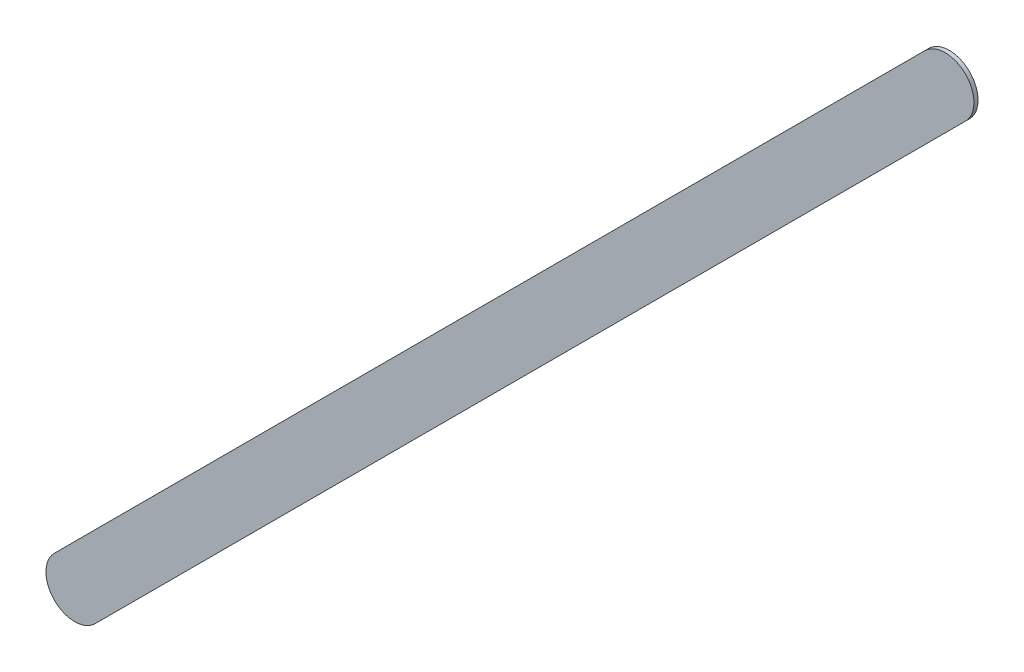
ISO-10303-21;
HEADER;
FILE_DESCRIPTION(('STEP AP214'),'2;1');
FILE_NAME('part.step','',(''),(''),'','','');
FILE_SCHEMA(('AUTOMOTIVE_DESIGN { 1 0 10303 214 1 1 1 1 }'));
ENDSEC;
DATA;
#1=APPLICATION_CONTEXT('core data for automotive mechanical design processes');
#2=APPLICATION_PROTOCOL_DEFINITION('international standard','automotive_design',2000,#1);
#3=PRODUCT_CONTEXT('',#1,'mechanical');
#4=PRODUCT('Part','Part','',(#3));
#5=PRODUCT_RELATED_PRODUCT_CATEGORY('part','',(#4));
#6=PRODUCT_DEFINITION_FORMATION('','',#4);
#7=PRODUCT_DEFINITION_CONTEXT('part definition',#1,'design');
#8=PRODUCT_DEFINITION('design','',#6,#7);
#9=PRODUCT_DEFINITION_SHAPE('','',#8);
#10=(LENGTH_UNIT() NAMED_UNIT(*) SI_UNIT(.MILLI.,.METRE.));
#11=(NAMED_UNIT(*) PLANE_ANGLE_UNIT() SI_UNIT($,.RADIAN.));
#12=(NAMED_UNIT(*) SI_UNIT($,.STERADIAN.) SOLID_ANGLE_UNIT());
#13=UNCERTAINTY_MEASURE_WITH_UNIT(LENGTH_MEASURE(1.E-05),#10,'distance_accuracy_value','');
#14=(GEOMETRIC_REPRESENTATION_CONTEXT(3) GLOBAL_UNCERTAINTY_ASSIGNED_CONTEXT((#13)) GLOBAL_UNIT_ASSIGNED_CONTEXT((#10,
#11,#12)) REPRESENTATION_CONTEXT('',''));
#15=CARTESIAN_POINT('',(0.,0.,0.));
#16=DIRECTION('',(0.,0.,1.));
#17=DIRECTION('',(1.,0.,0.));
#18=AXIS2_PLACEMENT_3D('',#15,#16,#17);
#19=CARTESIAN_POINT('',(89.01617706,73.76262362,0.));
#20=DIRECTION('',(-0.707106781186548,0.707106781186548,0.));
#21=DIRECTION('',(0.707106781186548,0.707106781186548,0.));
#22=AXIS2_PLACEMENT_3D('',#19,#20,#21);
#23=PLANE('',#22);
#24=DIRECTION('',(0.707106781186548,0.707106781186548,0.));
#25=VECTOR('',#24,1.);
#26=CARTESIAN_POINT('',(89.01617706,73.76262362,0.03556));
#27=LINE('',#26,#25);
#28=CARTESIAN_POINT('',(89.01617706,73.76262362,0.03556));
#29=VERTEX_POINT('',#28);
#30=CARTESIAN_POINT('',(96.57677662,81.32322318,0.03556));
#31=VERTEX_POINT('',#30);
#32=EDGE_CURVE('E11',#29,#31,#27,.T.);
#33=ORIENTED_EDGE('',*,*,#32,.F.);
#34=DIRECTION('',(0.,0.,1.));
#35=VECTOR('',#34,1.);
#36=CARTESIAN_POINT('',(89.01617706,73.76262362,0.));
#37=LINE('',#36,#35);
#38=CARTESIAN_POINT('',(89.01617706,73.76262362,0.));
#39=VERTEX_POINT('',#38);
#40=EDGE_CURVE('E24',#39,#29,#37,.T.);
#41=ORIENTED_EDGE('',*,*,#40,.F.);
#42=DIRECTION('',(0.707106781186548,0.707106781186548,0.));
#43=VECTOR('',#42,1.);
#44=CARTESIAN_POINT('',(89.01617706,73.76262362,0.));
#45=LINE('',#44,#43);
#46=CARTESIAN_POINT('',(96.57677662,81.32322318,0.));
#47=VERTEX_POINT('',#46);
#48=EDGE_CURVE('E75',#39,#47,#45,.T.);
#49=ORIENTED_EDGE('',*,*,#48,.T.);
#50=DIRECTION('',(0.,0.,1.));
#51=VECTOR('',#50,1.);
#52=CARTESIAN_POINT('',(96.57677662,81.32322318,0.));
#53=LINE('',#52,#51);
#54=EDGE_CURVE('E37',#47,#31,#53,.T.);
#55=ORIENTED_EDGE('',*,*,#54,.T.);
#56=EDGE_LOOP('',(#33,#41,#49,#55));
#57=FACE_BOUND('',#56,.T.);
#58=ADVANCED_FACE('F17',(#57),#23,.F.);
#59=CARTESIAN_POINT('',(96.40000024,81.49999956,0.));
#60=DIRECTION('',(0.,0.,-1.));
#61=DIRECTION('',(0.707106781186548,-0.707106781186548,0.));
#62=AXIS2_PLACEMENT_3D('',#59,#60,#61);
#63=CYLINDRICAL_SURFACE('',#62,0.24999955410322);
#64=CARTESIAN_POINT('',(96.40000024,81.49999956,0.03556));
#65=DIRECTION('',(0.,0.,1.));
#66=DIRECTION('',(0.707106781186548,-0.707106781186548,0.));
#67=AXIS2_PLACEMENT_3D('',#64,#65,#66);
#68=CIRCLE('',#67,0.24999955410322);
#69=CARTESIAN_POINT('',(96.22322386,81.67677594,0.03556));
#70=VERTEX_POINT('',#69);
#71=EDGE_CURVE('E83',#31,#70,#68,.T.);
#72=ORIENTED_EDGE('',*,*,#71,.F.);
#73=ORIENTED_EDGE('',*,*,#54,.F.);
#74=CARTESIAN_POINT('',(96.40000024,81.49999956,0.));
#75=DIRECTION('',(0.,0.,1.));
#76=DIRECTION('',(0.707106781186548,-0.707106781186548,0.));
#77=AXIS2_PLACEMENT_3D('',#74,#75,#76);
#78=CIRCLE('',#77,0.24999955410322);
#79=CARTESIAN_POINT('',(96.22322386,81.67677594,0.));
#80=VERTEX_POINT('',#79);
#81=EDGE_CURVE('E81',#47,#80,#78,.T.);
#82=ORIENTED_EDGE('',*,*,#81,.T.);
#83=DIRECTION('',(0.,0.,1.));
#84=VECTOR('',#83,1.);
#85=CARTESIAN_POINT('',(96.22322386,81.67677594,0.));
#86=LINE('',#85,#84);
#87=EDGE_CURVE('E67',#80,#70,#86,.T.);
#88=ORIENTED_EDGE('',*,*,#87,.T.);
#89=EDGE_LOOP('',(#72,#73,#82,#88));
#90=FACE_BOUND('',#89,.T.);
#91=ADVANCED_FACE('F89',(#90),#63,.T.);
#92=CARTESIAN_POINT('',(96.22322386,81.67677594,0.));
#93=DIRECTION('',(0.707106781186548,-0.707106781186547,0.));
#94=DIRECTION('',(-0.707106781186547,-0.707106781186548,0.));
#95=AXIS2_PLACEMENT_3D('',#92,#93,#94);
#96=PLANE('',#95);
#97=DIRECTION('',(-0.707106781186547,-0.707106781186548,0.));
#98=VECTOR('',#97,1.);
#99=CARTESIAN_POINT('',(96.22322386,81.67677594,0.03556));
#100=LINE('',#99,#98);
#101=CARTESIAN_POINT('',(88.6626243,74.11617638,0.03556));
#102=VERTEX_POINT('',#101);
#103=EDGE_CURVE('E71',#70,#102,#100,.T.);
#104=ORIENTED_EDGE('',*,*,#103,.F.);
#105=ORIENTED_EDGE('',*,*,#87,.F.);
#106=DIRECTION('',(-0.707106781186547,-0.707106781186548,0.));
#107=VECTOR('',#106,1.);
#108=CARTESIAN_POINT('',(96.22322386,81.67677594,0.));
#109=LINE('',#108,#107);
#110=CARTESIAN_POINT('',(88.6626243,74.11617638,0.));
#111=VERTEX_POINT('',#110);
#112=EDGE_CURVE('E63',#80,#111,#109,.T.);
#113=ORIENTED_EDGE('',*,*,#112,.T.);
#114=DIRECTION('',(0.,0.,1.));
#115=VECTOR('',#114,1.);
#116=CARTESIAN_POINT('',(88.6626243,74.11617638,0.));
#117=LINE('',#116,#115);
#118=EDGE_CURVE('E53',#111,#102,#117,.T.);
#119=ORIENTED_EDGE('',*,*,#118,.T.);
#120=EDGE_LOOP('',(#104,#105,#113,#119));
#121=FACE_BOUND('',#120,.T.);
#122=ADVANCED_FACE('F66',(#121),#96,.F.);
#123=CARTESIAN_POINT('',(88.83940068,73.9394,0.));
#124=DIRECTION('',(0.,0.,-1.));
#125=DIRECTION('',(-0.707106781186548,0.707106781186548,0.));
#126=AXIS2_PLACEMENT_3D('',#123,#124,#125);
#127=CYLINDRICAL_SURFACE('',#126,0.249999554103216);
#128=CARTESIAN_POINT('',(88.83940068,73.9394,0.03556));
#129=DIRECTION('',(0.,0.,1.));
#130=DIRECTION('',(-0.707106781186548,0.707106781186548,0.));
#131=AXIS2_PLACEMENT_3D('',#128,#129,#130);
#132=CIRCLE('',#131,0.249999554103216);
#133=EDGE_CURVE('E59',#102,#29,#132,.T.);
#134=ORIENTED_EDGE('',*,*,#133,.F.);
#135=ORIENTED_EDGE('',*,*,#118,.F.);
#136=CARTESIAN_POINT('',(88.83940068,73.9394,0.));
#137=DIRECTION('',(0.,0.,1.));
#138=DIRECTION('',(-0.707106781186548,0.707106781186548,0.));
#139=AXIS2_PLACEMENT_3D('',#136,#137,#138);
#140=CIRCLE('',#139,0.249999554103216);
#141=EDGE_CURVE('E57',#111,#39,#140,.T.);
#142=ORIENTED_EDGE('',*,*,#141,.T.);
#143=ORIENTED_EDGE('',*,*,#40,.T.);
#144=EDGE_LOOP('',(#134,#135,#142,#143));
#145=FACE_BOUND('',#144,.T.);
#146=ADVANCED_FACE('F55',(#145),#127,.T.);
#147=CARTESIAN_POINT('',(89.01617706,73.76262362,0.));
#148=DIRECTION('',(0.,0.,-1.));
#149=DIRECTION('',(-1.,0.,0.));
#150=AXIS2_PLACEMENT_3D('',#147,#148,#149);
#151=PLANE('',#150);
#152=ORIENTED_EDGE('',*,*,#141,.F.);
#153=ORIENTED_EDGE('',*,*,#112,.F.);
#154=ORIENTED_EDGE('',*,*,#81,.F.);
#155=ORIENTED_EDGE('',*,*,#48,.F.);
#156=EDGE_LOOP('',(#152,#153,#154,#155));
#157=FACE_BOUND('',#156,.T.);
#158=ADVANCED_FACE('F74',(#157),#151,.T.);
#159=CARTESIAN_POINT('',(89.01617706,73.76262362,0.03556));
#160=DIRECTION('',(0.,0.,-1.));
#161=DIRECTION('',(-1.,0.,0.));
#162=AXIS2_PLACEMENT_3D('',#159,#160,#161);
#163=PLANE('',#162);
#164=ORIENTED_EDGE('',*,*,#32,.T.);
#165=ORIENTED_EDGE('',*,*,#71,.T.);
#166=ORIENTED_EDGE('',*,*,#103,.T.);
#167=ORIENTED_EDGE('',*,*,#133,.T.);
#168=EDGE_LOOP('',(#164,#165,#166,#167));
#169=FACE_BOUND('',#168,.T.);
#170=ADVANCED_FACE('F91',(#169),#163,.F.);
#171=CLOSED_SHELL('',(#58,#91,#122,#146,#158,#170));
#172=MANIFOLD_SOLID_BREP('B1',#171);
#173=ADVANCED_BREP_SHAPE_REPRESENTATION('',(#18,#172),#14);
#174=SHAPE_DEFINITION_REPRESENTATION(#9,#173);
ENDSEC;
END-ISO-10303-21;
